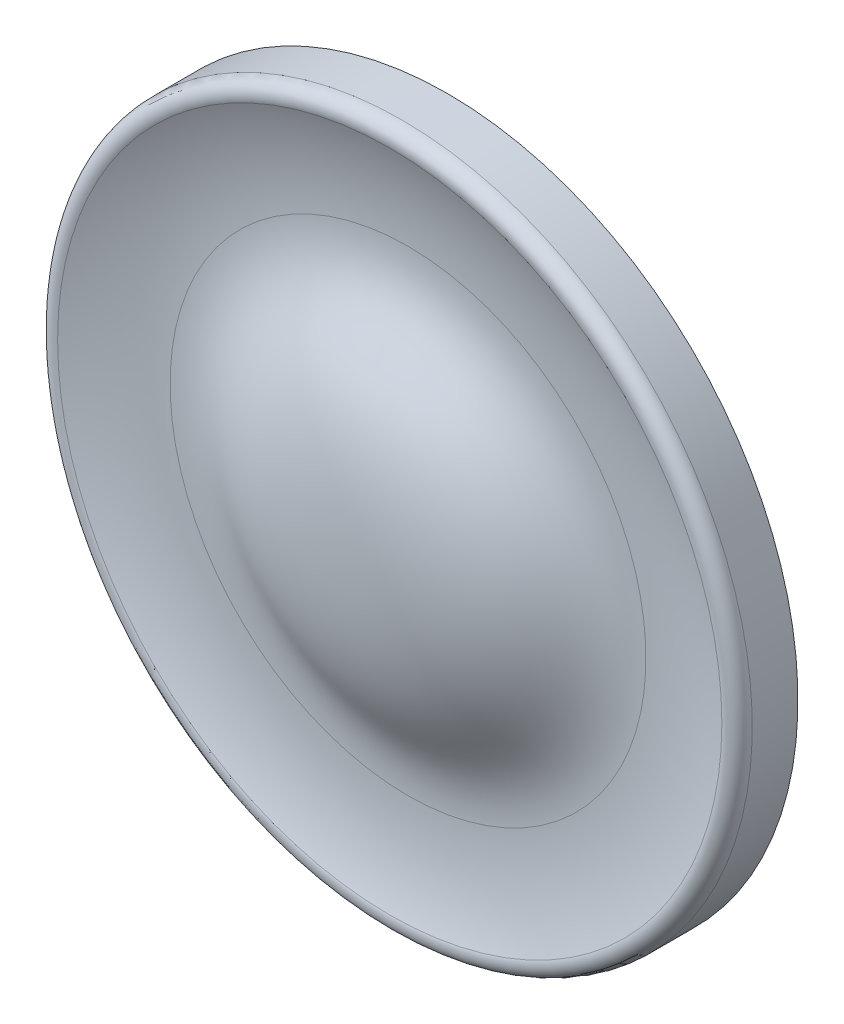
ISO-10303-21;
HEADER;
FILE_DESCRIPTION(('STEP AP214'),'2;1');
FILE_NAME('part.step','',(''),(''),'','','');
FILE_SCHEMA(('AUTOMOTIVE_DESIGN { 1 0 10303 214 1 1 1 1 }'));
ENDSEC;
DATA;
#1=APPLICATION_CONTEXT('core data for automotive mechanical design processes');
#2=APPLICATION_PROTOCOL_DEFINITION('international standard','automotive_design',2000,#1);
#3=PRODUCT_CONTEXT('',#1,'mechanical');
#4=PRODUCT('Part','Part','',(#3));
#5=PRODUCT_RELATED_PRODUCT_CATEGORY('part','',(#4));
#6=PRODUCT_DEFINITION_FORMATION('','',#4);
#7=PRODUCT_DEFINITION_CONTEXT('part definition',#1,'design');
#8=PRODUCT_DEFINITION('design','',#6,#7);
#9=PRODUCT_DEFINITION_SHAPE('','',#8);
#10=(LENGTH_UNIT() NAMED_UNIT(*) SI_UNIT(.MILLI.,.METRE.));
#11=(NAMED_UNIT(*) PLANE_ANGLE_UNIT() SI_UNIT($,.RADIAN.));
#12=(NAMED_UNIT(*) SI_UNIT($,.STERADIAN.) SOLID_ANGLE_UNIT());
#13=UNCERTAINTY_MEASURE_WITH_UNIT(LENGTH_MEASURE(1.E-05),#10,'distance_accuracy_value','');
#14=(GEOMETRIC_REPRESENTATION_CONTEXT(3) GLOBAL_UNCERTAINTY_ASSIGNED_CONTEXT((#13)) GLOBAL_UNIT_ASSIGNED_CONTEXT((#10,
#11,#12)) REPRESENTATION_CONTEXT('',''));
#15=CARTESIAN_POINT('',(0.,0.,0.));
#16=DIRECTION('',(0.,0.,1.));
#17=DIRECTION('',(1.,0.,0.));
#18=AXIS2_PLACEMENT_3D('',#15,#16,#17);
#19=CARTESIAN_POINT('',(0.,13.25,0.));
#20=DIRECTION('',(0.,0.,-1.));
#21=DIRECTION('',(0.,1.,0.));
#22=AXIS2_PLACEMENT_3D('',#19,#20,#21);
#23=PLANE('',#22);
#24=CARTESIAN_POINT('',(0.,0.,0.));
#25=DIRECTION('',(0.,0.,1.));
#26=DIRECTION('',(1.,0.,0.));
#27=AXIS2_PLACEMENT_3D('',#24,#25,#26);
#28=CIRCLE('',#27,9.);
#29=CARTESIAN_POINT('',(9.,0.,0.));
#30=VERTEX_POINT('',#29);
#31=EDGE_CURVE('E56',#30,#30,#28,.T.);
#32=ORIENTED_EDGE('',*,*,#31,.T.);
#33=EDGE_LOOP('',(#32));
#34=FACE_BOUND('',#33,.T.);
#35=CARTESIAN_POINT('',(0.,0.,0.));
#36=DIRECTION('',(0.,0.,-1.));
#37=DIRECTION('',(0.,1.,0.));
#38=AXIS2_PLACEMENT_3D('',#35,#36,#37);
#39=CIRCLE('',#38,13.25);
#40=CARTESIAN_POINT('',(0.,13.25,0.));
#41=VERTEX_POINT('',#40);
#42=EDGE_CURVE('E11',#41,#41,#39,.T.);
#43=ORIENTED_EDGE('',*,*,#42,.T.);
#44=EDGE_LOOP('',(#43));
#45=FACE_BOUND('',#44,.T.);
#46=ADVANCED_FACE('F36',(#34,#45),#23,.T.);
#47=CARTESIAN_POINT('',(0.,0.,0.));
#48=DIRECTION('',(0.,0.,-1.));
#49=DIRECTION('',(0.,1.,0.));
#50=AXIS2_PLACEMENT_3D('',#47,#48,#49);
#51=CYLINDRICAL_SURFACE('',#50,13.25);
#52=CARTESIAN_POINT('',(0.,0.,1.72730048581518));
#53=DIRECTION('',(0.,0.,-1.));
#54=DIRECTION('',(0.,1.,0.));
#55=AXIS2_PLACEMENT_3D('',#52,#53,#54);
#56=CIRCLE('',#55,13.25);
#57=CARTESIAN_POINT('',(0.,13.25,1.72730048581518));
#58=VERTEX_POINT('',#57);
#59=EDGE_CURVE('E43',#58,#58,#56,.T.);
#60=ORIENTED_EDGE('',*,*,#59,.T.);
#61=EDGE_LOOP('',(#60));
#62=FACE_BOUND('',#61,.T.);
#63=ORIENTED_EDGE('',*,*,#42,.F.);
#64=EDGE_LOOP('',(#63));
#65=FACE_BOUND('',#64,.T.);
#66=ADVANCED_FACE('F84',(#62,#65),#51,.T.);
#67=CARTESIAN_POINT('',(0.,0.,1.72730048581518));
#68=DIRECTION('',(0.,0.,-1.));
#69=DIRECTION('',(0.,1.,0.));
#70=AXIS2_PLACEMENT_3D('',#67,#68,#69);
#71=TOROIDAL_SURFACE('',#70,12.75,0.500000000000003);
#72=CARTESIAN_POINT('',(0.,0.,2.19104874820445));
#73=DIRECTION('',(0.,0.,-1.));
#74=DIRECTION('',(0.,1.,0.));
#75=AXIS2_PLACEMENT_3D('',#72,#73,#74);
#76=CIRCLE('',#75,12.5630841121495);
#77=CARTESIAN_POINT('',(0.,12.5630841121495,2.19104874820446));
#78=VERTEX_POINT('',#77);
#79=EDGE_CURVE('E61',#78,#78,#76,.T.);
#80=ORIENTED_EDGE('',*,*,#79,.T.);
#81=EDGE_LOOP('',(#80));
#82=FACE_BOUND('',#81,.T.);
#83=ORIENTED_EDGE('',*,*,#59,.F.);
#84=EDGE_LOOP('',(#83));
#85=FACE_BOUND('',#84,.T.);
#86=ADVANCED_FACE('F81',(#82,#85),#71,.T.);
#87=CARTESIAN_POINT('',(0.,0.,11.03125));
#88=DIRECTION('',(0.,0.,-1.));
#89=DIRECTION('',(0.,1.,0.));
#90=AXIS2_PLACEMENT_3D('',#87,#88,#89);
#91=DEGENERATE_TOROIDAL_SURFACE('',#90,9.,9.53125,.T.);
#92=CARTESIAN_POINT('',(0.,0.,1.5));
#93=DIRECTION('',(0.,0.,-1.));
#94=DIRECTION('',(0.,1.,0.));
#95=AXIS2_PLACEMENT_3D('',#92,#93,#94);
#96=CIRCLE('',#95,9.);
#97=CARTESIAN_POINT('',(0.,9.,1.5));
#98=VERTEX_POINT('',#97);
#99=EDGE_CURVE('E58',#98,#98,#96,.T.);
#100=ORIENTED_EDGE('',*,*,#99,.T.);
#101=EDGE_LOOP('',(#100));
#102=FACE_BOUND('',#101,.T.);
#103=ORIENTED_EDGE('',*,*,#79,.F.);
#104=EDGE_LOOP('',(#103));
#105=FACE_BOUND('',#104,.T.);
#106=ADVANCED_FACE('F78',(#102,#105),#91,.F.);
#107=CARTESIAN_POINT('',(0.,9.,1.5));
#108=CARTESIAN_POINT('',(0.,6.,1.5));
#109=CARTESIAN_POINT('',(0.,6.00000000000001,4.));
#110=CARTESIAN_POINT('',(0.,0.,4.));
#111=B_SPLINE_CURVE_WITH_KNOTS('',3,(#107,#108,#109,#110),.UNSPECIFIED.,.F.,.F.,(4,4),(0.,1.),.UNSPECIFIED.);
#112=CARTESIAN_POINT('',(0.,0.,0.));
#113=DIRECTION('',(0.,0.,-1.));
#114=AXIS1_PLACEMENT('',#112,#113);
#115=SURFACE_OF_REVOLUTION('',#111,#114);
#116=CARTESIAN_POINT('',(0.,0.,4.));
#117=VERTEX_POINT('',#116);
#118=VERTEX_LOOP('',#117);
#119=FACE_BOUND('',#118,.T.);
#120=ORIENTED_EDGE('',*,*,#99,.F.);
#121=EDGE_LOOP('',(#120));
#122=FACE_BOUND('',#121,.T.);
#123=ADVANCED_FACE('F52',(#119,#122),#115,.F.);
#124=CARTESIAN_POINT('',(0.,9.,0.));
#125=CARTESIAN_POINT('',(0.,6.,0.));
#126=CARTESIAN_POINT('',(0.,6.,3.));
#127=CARTESIAN_POINT('',(0.,0.,3.));
#128=B_SPLINE_CURVE_WITH_KNOTS('',3,(#124,#125,#126,#127),.UNSPECIFIED.,.F.,.F.,(4,4),(0.,1.),.UNSPECIFIED.);
#129=CARTESIAN_POINT('',(0.,0.,0.));
#130=DIRECTION('',(0.,0.,1.));
#131=AXIS1_PLACEMENT('',#129,#130);
#132=SURFACE_OF_REVOLUTION('',#128,#131);
#133=CARTESIAN_POINT('',(0.,0.,3.));
#134=VERTEX_POINT('',#133);
#135=VERTEX_LOOP('',#134);
#136=FACE_BOUND('',#135,.T.);
#137=ORIENTED_EDGE('',*,*,#31,.F.);
#138=EDGE_LOOP('',(#137));
#139=FACE_BOUND('',#138,.T.);
#140=ADVANCED_FACE('F49',(#136,#139),#132,.F.);
#141=CLOSED_SHELL('',(#46,#66,#86,#106,#123,#140));
#142=MANIFOLD_SOLID_BREP('B2',#141);
#143=ADVANCED_BREP_SHAPE_REPRESENTATION('',(#18,#142),#14);
#144=SHAPE_DEFINITION_REPRESENTATION(#9,#143);
ENDSEC;
END-ISO-10303-21;
